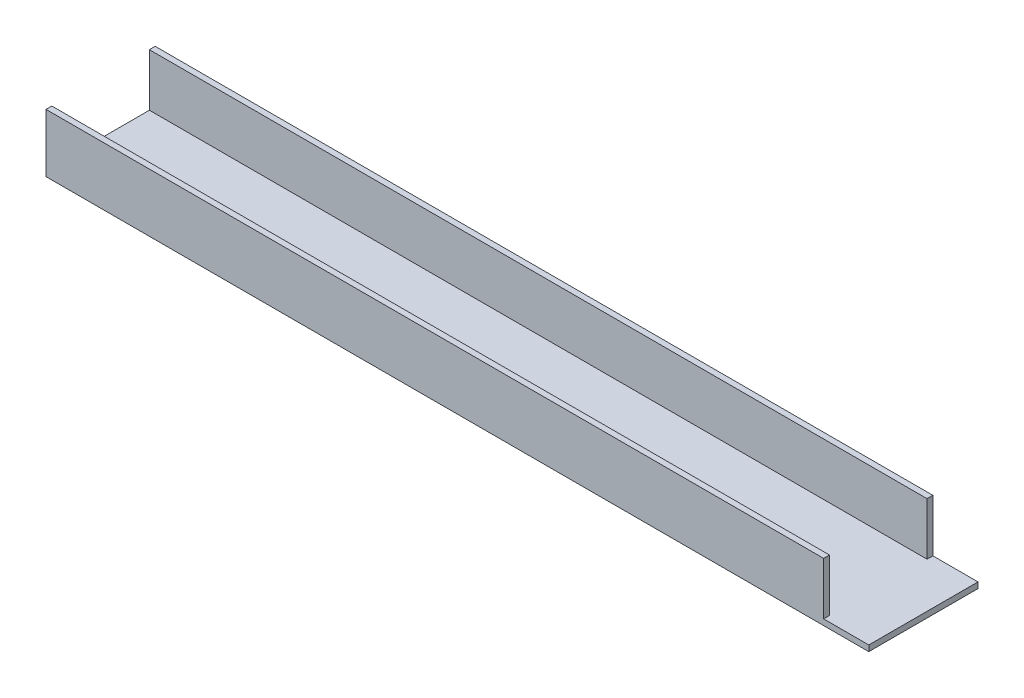
ISO-10303-21;
HEADER;
FILE_DESCRIPTION(('STEP AP214'),'2;1');
FILE_NAME('part.step','',(''),(''),'','','');
FILE_SCHEMA(('AUTOMOTIVE_DESIGN { 1 0 10303 214 1 1 1 1 }'));
ENDSEC;
DATA;
#1=APPLICATION_CONTEXT('core data for automotive mechanical design processes');
#2=APPLICATION_PROTOCOL_DEFINITION('international standard','automotive_design',2000,#1);
#3=PRODUCT_CONTEXT('',#1,'mechanical');
#4=PRODUCT('Part','Part','',(#3));
#5=PRODUCT_RELATED_PRODUCT_CATEGORY('part','',(#4));
#6=PRODUCT_DEFINITION_FORMATION('','',#4);
#7=PRODUCT_DEFINITION_CONTEXT('part definition',#1,'design');
#8=PRODUCT_DEFINITION('design','',#6,#7);
#9=PRODUCT_DEFINITION_SHAPE('','',#8);
#10=(LENGTH_UNIT() NAMED_UNIT(*) SI_UNIT(.MILLI.,.METRE.));
#11=(NAMED_UNIT(*) PLANE_ANGLE_UNIT() SI_UNIT($,.RADIAN.));
#12=(NAMED_UNIT(*) SI_UNIT($,.STERADIAN.) SOLID_ANGLE_UNIT());
#13=UNCERTAINTY_MEASURE_WITH_UNIT(LENGTH_MEASURE(1.E-05),#10,'distance_accuracy_value','');
#14=(GEOMETRIC_REPRESENTATION_CONTEXT(3) GLOBAL_UNCERTAINTY_ASSIGNED_CONTEXT((#13)) GLOBAL_UNIT_ASSIGNED_CONTEXT((#10,
#11,#12)) REPRESENTATION_CONTEXT('',''));
#15=CARTESIAN_POINT('',(0.,0.,0.));
#16=DIRECTION('',(0.,0.,1.));
#17=DIRECTION('',(1.,0.,0.));
#18=AXIS2_PLACEMENT_3D('',#15,#16,#17);
#19=CARTESIAN_POINT('',(0.,4.,0.));
#20=DIRECTION('',(0.,-1.,0.));
#21=DIRECTION('',(0.,0.,-1.));
#22=AXIS2_PLACEMENT_3D('',#19,#20,#21);
#23=PLANE('',#22);
#24=DIRECTION('',(0.,0.,-1.));
#25=VECTOR('',#24,1.);
#26=CARTESIAN_POINT('',(534.,4.,-75.));
#27=LINE('',#26,#25);
#28=CARTESIAN_POINT('',(534.,4.,-71.));
#29=VERTEX_POINT('',#28);
#30=CARTESIAN_POINT('',(534.,4.,-75.));
#31=VERTEX_POINT('',#30);
#32=EDGE_CURVE('E61',#29,#31,#27,.T.);
#33=ORIENTED_EDGE('',*,*,#32,.F.);
#34=DIRECTION('',(1.,0.,0.));
#35=VECTOR('',#34,1.);
#36=CARTESIAN_POINT('',(534.,4.,-71.));
#37=LINE('',#36,#35);
#38=CARTESIAN_POINT('',(0.,4.,-70.9999999999999));
#39=VERTEX_POINT('',#38);
#40=EDGE_CURVE('E65',#39,#29,#37,.T.);
#41=ORIENTED_EDGE('',*,*,#40,.F.);
#42=DIRECTION('',(0.,0.,1.));
#43=VECTOR('',#42,1.);
#44=CARTESIAN_POINT('',(0.,4.,0.));
#45=LINE('',#44,#43);
#46=CARTESIAN_POINT('',(0.,4.,-4.));
#47=VERTEX_POINT('',#46);
#48=EDGE_CURVE('E188',#39,#47,#45,.T.);
#49=ORIENTED_EDGE('',*,*,#48,.T.);
#50=DIRECTION('',(-1.,0.,0.));
#51=VECTOR('',#50,1.);
#52=CARTESIAN_POINT('',(0.,4.,-4.));
#53=LINE('',#52,#51);
#54=CARTESIAN_POINT('',(534.,4.,-4.));
#55=VERTEX_POINT('',#54);
#56=EDGE_CURVE('E159',#55,#47,#53,.T.);
#57=ORIENTED_EDGE('',*,*,#56,.F.);
#58=DIRECTION('',(0.,0.,-1.));
#59=VECTOR('',#58,1.);
#60=CARTESIAN_POINT('',(534.,4.,0.));
#61=LINE('',#60,#59);
#62=CARTESIAN_POINT('',(534.,4.,0.));
#63=VERTEX_POINT('',#62);
#64=EDGE_CURVE('E169',#63,#55,#61,.T.);
#65=ORIENTED_EDGE('',*,*,#64,.F.);
#66=DIRECTION('',(1.,0.,0.));
#67=VECTOR('',#66,1.);
#68=CARTESIAN_POINT('',(0.,4.,0.));
#69=LINE('',#68,#67);
#70=CARTESIAN_POINT('',(565.,4.,0.));
#71=VERTEX_POINT('',#70);
#72=EDGE_CURVE('E191',#63,#71,#69,.T.);
#73=ORIENTED_EDGE('',*,*,#72,.T.);
#74=DIRECTION('',(0.,0.,-1.));
#75=VECTOR('',#74,1.);
#76=CARTESIAN_POINT('',(565.,4.,0.));
#77=LINE('',#76,#75);
#78=CARTESIAN_POINT('',(565.,4.,-75.));
#79=VERTEX_POINT('',#78);
#80=EDGE_CURVE('E195',#71,#79,#77,.T.);
#81=ORIENTED_EDGE('',*,*,#80,.T.);
#82=DIRECTION('',(-1.,0.,0.));
#83=VECTOR('',#82,1.);
#84=CARTESIAN_POINT('',(0.,4.,-75.));
#85=LINE('',#84,#83);
#86=EDGE_CURVE('E198',#79,#31,#85,.T.);
#87=ORIENTED_EDGE('',*,*,#86,.T.);
#88=EDGE_LOOP('',(#33,#41,#49,#57,#65,#73,#81,#87));
#89=FACE_BOUND('',#88,.T.);
#90=ADVANCED_FACE('F45',(#89),#23,.F.);
#91=CARTESIAN_POINT('',(0.,4.,0.));
#92=DIRECTION('',(1.,0.,0.));
#93=DIRECTION('',(0.,0.,-1.));
#94=AXIS2_PLACEMENT_3D('',#91,#92,#93);
#95=PLANE('',#94);
#96=DIRECTION('',(0.,0.,1.));
#97=VECTOR('',#96,1.);
#98=CARTESIAN_POINT('',(0.,0.,0.));
#99=LINE('',#98,#97);
#100=CARTESIAN_POINT('',(0.,0.,-75.));
#101=VERTEX_POINT('',#100);
#102=CARTESIAN_POINT('',(0.,0.,0.));
#103=VERTEX_POINT('',#102);
#104=EDGE_CURVE('E187',#101,#103,#99,.T.);
#105=ORIENTED_EDGE('',*,*,#104,.T.);
#106=DIRECTION('',(0.,-1.,0.));
#107=VECTOR('',#106,1.);
#108=CARTESIAN_POINT('',(0.,4.,0.));
#109=LINE('',#108,#107);
#110=CARTESIAN_POINT('',(0.,40.,0.));
#111=VERTEX_POINT('',#110);
#112=EDGE_CURVE('E11',#111,#103,#109,.T.);
#113=ORIENTED_EDGE('',*,*,#112,.F.);
#114=DIRECTION('',(0.,0.,1.));
#115=VECTOR('',#114,1.);
#116=CARTESIAN_POINT('',(0.,40.,0.));
#117=LINE('',#116,#115);
#118=CARTESIAN_POINT('',(0.,40.,-4.));
#119=VERTEX_POINT('',#118);
#120=EDGE_CURVE('E154',#119,#111,#117,.T.);
#121=ORIENTED_EDGE('',*,*,#120,.F.);
#122=DIRECTION('',(0.,-1.,0.));
#123=VECTOR('',#122,1.);
#124=CARTESIAN_POINT('',(0.,40.,-4.));
#125=LINE('',#124,#123);
#126=EDGE_CURVE('E168',#119,#47,#125,.T.);
#127=ORIENTED_EDGE('',*,*,#126,.T.);
#128=ORIENTED_EDGE('',*,*,#48,.F.);
#129=DIRECTION('',(0.,-1.,0.));
#130=VECTOR('',#129,1.);
#131=CARTESIAN_POINT('',(0.,40.,-70.9999999999999));
#132=LINE('',#131,#130);
#133=CARTESIAN_POINT('',(0.,40.,-70.9999999999999));
#134=VERTEX_POINT('',#133);
#135=EDGE_CURVE('E140',#134,#39,#132,.T.);
#136=ORIENTED_EDGE('',*,*,#135,.F.);
#137=DIRECTION('',(0.,0.,1.));
#138=VECTOR('',#137,1.);
#139=CARTESIAN_POINT('',(0.,40.,-75.));
#140=LINE('',#139,#138);
#141=CARTESIAN_POINT('',(0.,40.,-75.));
#142=VERTEX_POINT('',#141);
#143=EDGE_CURVE('E129',#142,#134,#140,.T.);
#144=ORIENTED_EDGE('',*,*,#143,.F.);
#145=DIRECTION('',(0.,-1.,0.));
#146=VECTOR('',#145,1.);
#147=CARTESIAN_POINT('',(0.,4.,-75.));
#148=LINE('',#147,#146);
#149=EDGE_CURVE('E201',#142,#101,#148,.T.);
#150=ORIENTED_EDGE('',*,*,#149,.T.);
#151=EDGE_LOOP('',(#105,#113,#121,#127,#128,#136,#144,#150));
#152=FACE_BOUND('',#151,.T.);
#153=ADVANCED_FACE('F47',(#152),#95,.F.);
#154=CARTESIAN_POINT('',(0.,4.,0.));
#155=DIRECTION('',(0.,0.,-1.));
#156=DIRECTION('',(-1.,0.,0.));
#157=AXIS2_PLACEMENT_3D('',#154,#155,#156);
#158=PLANE('',#157);
#159=DIRECTION('',(1.,0.,0.));
#160=VECTOR('',#159,1.);
#161=CARTESIAN_POINT('',(0.,0.,0.));
#162=LINE('',#161,#160);
#163=CARTESIAN_POINT('',(565.,0.,0.));
#164=VERTEX_POINT('',#163);
#165=EDGE_CURVE('E205',#103,#164,#162,.T.);
#166=ORIENTED_EDGE('',*,*,#165,.T.);
#167=DIRECTION('',(0.,-1.,0.));
#168=VECTOR('',#167,1.);
#169=CARTESIAN_POINT('',(565.,4.,0.));
#170=LINE('',#169,#168);
#171=EDGE_CURVE('E54',#71,#164,#170,.T.);
#172=ORIENTED_EDGE('',*,*,#171,.F.);
#173=ORIENTED_EDGE('',*,*,#72,.F.);
#174=DIRECTION('',(0.,-1.,0.));
#175=VECTOR('',#174,1.);
#176=CARTESIAN_POINT('',(534.,40.,0.));
#177=LINE('',#176,#175);
#178=CARTESIAN_POINT('',(534.,40.,0.));
#179=VERTEX_POINT('',#178);
#180=EDGE_CURVE('E183',#179,#63,#177,.T.);
#181=ORIENTED_EDGE('',*,*,#180,.F.);
#182=DIRECTION('',(1.,0.,0.));
#183=VECTOR('',#182,1.);
#184=CARTESIAN_POINT('',(0.,40.,0.));
#185=LINE('',#184,#183);
#186=EDGE_CURVE('E158',#111,#179,#185,.T.);
#187=ORIENTED_EDGE('',*,*,#186,.F.);
#188=ORIENTED_EDGE('',*,*,#112,.T.);
#189=EDGE_LOOP('',(#166,#172,#173,#181,#187,#188));
#190=FACE_BOUND('',#189,.T.);
#191=ADVANCED_FACE('F245',(#190),#158,.F.);
#192=CARTESIAN_POINT('',(565.,4.,0.));
#193=DIRECTION('',(-1.,0.,0.));
#194=DIRECTION('',(0.,0.,1.));
#195=AXIS2_PLACEMENT_3D('',#192,#193,#194);
#196=PLANE('',#195);
#197=DIRECTION('',(0.,0.,-1.));
#198=VECTOR('',#197,1.);
#199=CARTESIAN_POINT('',(565.,0.,0.));
#200=LINE('',#199,#198);
#201=CARTESIAN_POINT('',(565.,0.,-75.));
#202=VERTEX_POINT('',#201);
#203=EDGE_CURVE('E208',#164,#202,#200,.T.);
#204=ORIENTED_EDGE('',*,*,#203,.T.);
#205=DIRECTION('',(0.,-1.,0.));
#206=VECTOR('',#205,1.);
#207=CARTESIAN_POINT('',(565.,4.,-75.));
#208=LINE('',#207,#206);
#209=EDGE_CURVE('E216',#79,#202,#208,.T.);
#210=ORIENTED_EDGE('',*,*,#209,.F.);
#211=ORIENTED_EDGE('',*,*,#80,.F.);
#212=ORIENTED_EDGE('',*,*,#171,.T.);
#213=EDGE_LOOP('',(#204,#210,#211,#212));
#214=FACE_BOUND('',#213,.T.);
#215=ADVANCED_FACE('F225',(#214),#196,.F.);
#216=CARTESIAN_POINT('',(0.,4.,-75.));
#217=DIRECTION('',(0.,0.,1.));
#218=DIRECTION('',(1.,0.,0.));
#219=AXIS2_PLACEMENT_3D('',#216,#217,#218);
#220=PLANE('',#219);
#221=DIRECTION('',(-1.,0.,0.));
#222=VECTOR('',#221,1.);
#223=CARTESIAN_POINT('',(0.,0.,-75.));
#224=LINE('',#223,#222);
#225=EDGE_CURVE('E192',#202,#101,#224,.T.);
#226=ORIENTED_EDGE('',*,*,#225,.T.);
#227=ORIENTED_EDGE('',*,*,#149,.F.);
#228=DIRECTION('',(-1.,0.,0.));
#229=VECTOR('',#228,1.);
#230=CARTESIAN_POINT('',(534.,40.,-75.));
#231=LINE('',#230,#229);
#232=CARTESIAN_POINT('',(534.,40.,-75.));
#233=VERTEX_POINT('',#232);
#234=EDGE_CURVE('E146',#233,#142,#231,.T.);
#235=ORIENTED_EDGE('',*,*,#234,.F.);
#236=DIRECTION('',(0.,-1.,0.));
#237=VECTOR('',#236,1.);
#238=CARTESIAN_POINT('',(534.,40.,-75.));
#239=LINE('',#238,#237);
#240=EDGE_CURVE('E144',#233,#31,#239,.T.);
#241=ORIENTED_EDGE('',*,*,#240,.T.);
#242=ORIENTED_EDGE('',*,*,#86,.F.);
#243=ORIENTED_EDGE('',*,*,#209,.T.);
#244=EDGE_LOOP('',(#226,#227,#235,#241,#242,#243));
#245=FACE_BOUND('',#244,.T.);
#246=ADVANCED_FACE('F234',(#245),#220,.F.);
#247=CARTESIAN_POINT('',(0.,0.,0.));
#248=DIRECTION('',(0.,-1.,0.));
#249=DIRECTION('',(0.,0.,-1.));
#250=AXIS2_PLACEMENT_3D('',#247,#248,#249);
#251=PLANE('',#250);
#252=ORIENTED_EDGE('',*,*,#104,.F.);
#253=ORIENTED_EDGE('',*,*,#225,.F.);
#254=ORIENTED_EDGE('',*,*,#203,.F.);
#255=ORIENTED_EDGE('',*,*,#165,.F.);
#256=EDGE_LOOP('',(#252,#253,#254,#255));
#257=FACE_BOUND('',#256,.T.);
#258=ADVANCED_FACE('F232',(#257),#251,.T.);
#259=CARTESIAN_POINT('',(534.,40.,0.));
#260=DIRECTION('',(-1.,0.,0.));
#261=DIRECTION('',(0.,0.,1.));
#262=AXIS2_PLACEMENT_3D('',#259,#260,#261);
#263=PLANE('',#262);
#264=ORIENTED_EDGE('',*,*,#64,.T.);
#265=DIRECTION('',(0.,-1.,0.));
#266=VECTOR('',#265,1.);
#267=CARTESIAN_POINT('',(534.,40.,-4.));
#268=LINE('',#267,#266);
#269=CARTESIAN_POINT('',(534.,40.,-4.));
#270=VERTEX_POINT('',#269);
#271=EDGE_CURVE('E179',#270,#55,#268,.T.);
#272=ORIENTED_EDGE('',*,*,#271,.F.);
#273=DIRECTION('',(0.,0.,-1.));
#274=VECTOR('',#273,1.);
#275=CARTESIAN_POINT('',(534.,40.,0.));
#276=LINE('',#275,#274);
#277=EDGE_CURVE('E162',#179,#270,#276,.T.);
#278=ORIENTED_EDGE('',*,*,#277,.F.);
#279=ORIENTED_EDGE('',*,*,#180,.T.);
#280=EDGE_LOOP('',(#264,#272,#278,#279));
#281=FACE_BOUND('',#280,.T.);
#282=ADVANCED_FACE('F249',(#281),#263,.F.);
#283=CARTESIAN_POINT('',(0.,40.,-4.));
#284=DIRECTION('',(0.,0.,1.));
#285=DIRECTION('',(1.,0.,0.));
#286=AXIS2_PLACEMENT_3D('',#283,#284,#285);
#287=PLANE('',#286);
#288=ORIENTED_EDGE('',*,*,#56,.T.);
#289=ORIENTED_EDGE('',*,*,#126,.F.);
#290=DIRECTION('',(-1.,0.,0.));
#291=VECTOR('',#290,1.);
#292=CARTESIAN_POINT('',(0.,40.,-4.));
#293=LINE('',#292,#291);
#294=EDGE_CURVE('E165',#270,#119,#293,.T.);
#295=ORIENTED_EDGE('',*,*,#294,.F.);
#296=ORIENTED_EDGE('',*,*,#271,.T.);
#297=EDGE_LOOP('',(#288,#289,#295,#296));
#298=FACE_BOUND('',#297,.T.);
#299=ADVANCED_FACE('F257',(#298),#287,.F.);
#300=CARTESIAN_POINT('',(0.,40.,0.));
#301=DIRECTION('',(0.,-1.,0.));
#302=DIRECTION('',(0.,0.,-1.));
#303=AXIS2_PLACEMENT_3D('',#300,#301,#302);
#304=PLANE('',#303);
#305=ORIENTED_EDGE('',*,*,#120,.T.);
#306=ORIENTED_EDGE('',*,*,#186,.T.);
#307=ORIENTED_EDGE('',*,*,#277,.T.);
#308=ORIENTED_EDGE('',*,*,#294,.T.);
#309=EDGE_LOOP('',(#305,#306,#307,#308));
#310=FACE_BOUND('',#309,.T.);
#311=ADVANCED_FACE('F253',(#310),#304,.F.);
#312=CARTESIAN_POINT('',(534.,40.,-75.));
#313=DIRECTION('',(-1.,0.,0.));
#314=DIRECTION('',(0.,0.,1.));
#315=AXIS2_PLACEMENT_3D('',#312,#313,#314);
#316=PLANE('',#315);
#317=ORIENTED_EDGE('',*,*,#32,.T.);
#318=ORIENTED_EDGE('',*,*,#240,.F.);
#319=DIRECTION('',(0.,0.,-1.));
#320=VECTOR('',#319,1.);
#321=CARTESIAN_POINT('',(534.,40.,-75.));
#322=LINE('',#321,#320);
#323=CARTESIAN_POINT('',(534.,40.,-71.));
#324=VERTEX_POINT('',#323);
#325=EDGE_CURVE('E126',#324,#233,#322,.T.);
#326=ORIENTED_EDGE('',*,*,#325,.F.);
#327=DIRECTION('',(0.,-1.,0.));
#328=VECTOR('',#327,1.);
#329=CARTESIAN_POINT('',(534.,40.,-71.));
#330=LINE('',#329,#328);
#331=EDGE_CURVE('E134',#324,#29,#330,.T.);
#332=ORIENTED_EDGE('',*,*,#331,.T.);
#333=EDGE_LOOP('',(#317,#318,#326,#332));
#334=FACE_BOUND('',#333,.T.);
#335=ADVANCED_FACE('F142',(#334),#316,.F.);
#336=CARTESIAN_POINT('',(534.,40.,-71.));
#337=DIRECTION('',(0.,0.,-1.));
#338=DIRECTION('',(-1.,0.,0.));
#339=AXIS2_PLACEMENT_3D('',#336,#337,#338);
#340=PLANE('',#339);
#341=ORIENTED_EDGE('',*,*,#40,.T.);
#342=ORIENTED_EDGE('',*,*,#331,.F.);
#343=DIRECTION('',(1.,0.,0.));
#344=VECTOR('',#343,1.);
#345=CARTESIAN_POINT('',(534.,40.,-71.));
#346=LINE('',#345,#344);
#347=EDGE_CURVE('E121',#134,#324,#346,.T.);
#348=ORIENTED_EDGE('',*,*,#347,.F.);
#349=ORIENTED_EDGE('',*,*,#135,.T.);
#350=EDGE_LOOP('',(#341,#342,#348,#349));
#351=FACE_BOUND('',#350,.T.);
#352=ADVANCED_FACE('F137',(#351),#340,.F.);
#353=CARTESIAN_POINT('',(0.,40.,0.));
#354=DIRECTION('',(0.,-1.,0.));
#355=DIRECTION('',(0.,0.,-1.));
#356=AXIS2_PLACEMENT_3D('',#353,#354,#355);
#357=PLANE('',#356);
#358=ORIENTED_EDGE('',*,*,#325,.T.);
#359=ORIENTED_EDGE('',*,*,#234,.T.);
#360=ORIENTED_EDGE('',*,*,#143,.T.);
#361=ORIENTED_EDGE('',*,*,#347,.T.);
#362=EDGE_LOOP('',(#358,#359,#360,#361));
#363=FACE_BOUND('',#362,.T.);
#364=ADVANCED_FACE('F123',(#363),#357,.F.);
#365=CLOSED_SHELL('',(#90,#153,#191,#215,#246,#258,#282,#299,#311,#335,#352,#364));
#366=MANIFOLD_SOLID_BREP('B2',#365);
#367=ADVANCED_BREP_SHAPE_REPRESENTATION('',(#18,#366),#14);
#368=SHAPE_DEFINITION_REPRESENTATION(#9,#367);
ENDSEC;
END-ISO-10303-21;
